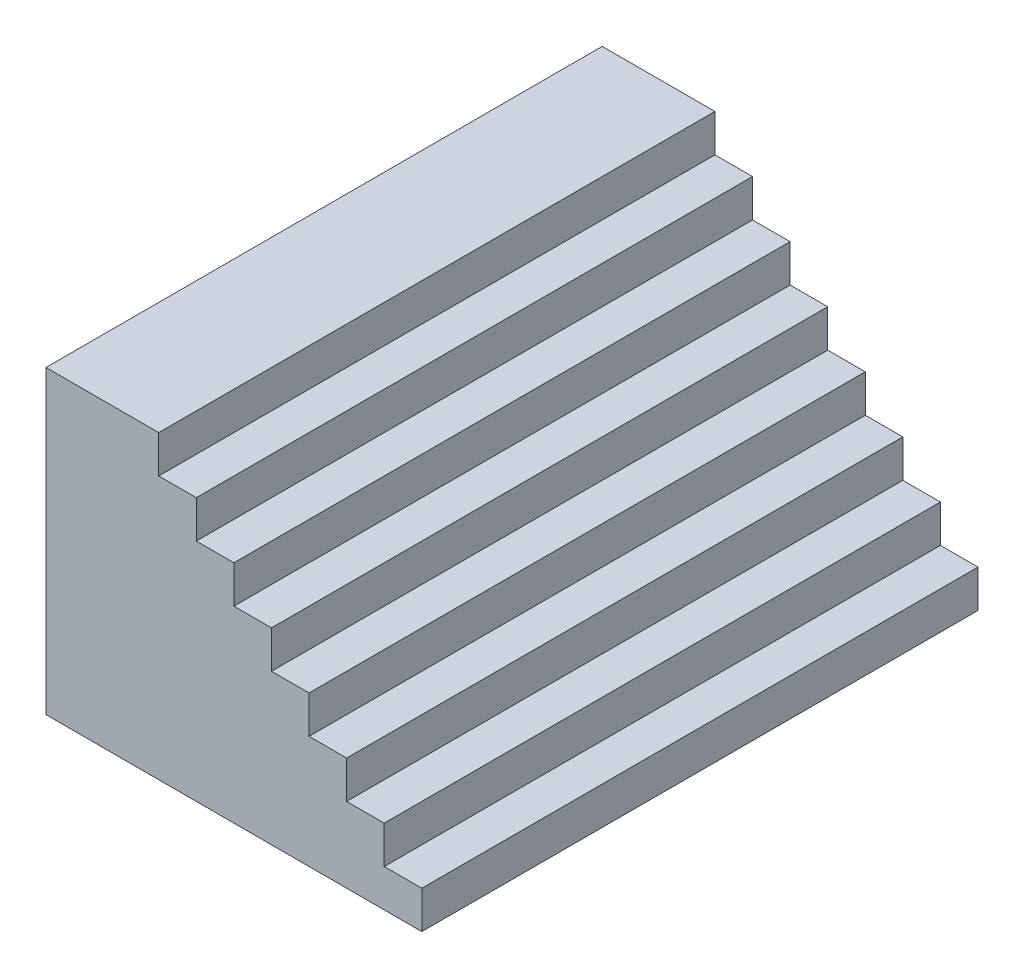
ISO-10303-21;
HEADER;
FILE_DESCRIPTION(('STEP AP214'),'2;1');
FILE_NAME('part.step','',(''),(''),'','','');
FILE_SCHEMA(('AUTOMOTIVE_DESIGN { 1 0 10303 214 1 1 1 1 }'));
ENDSEC;
DATA;
#1=APPLICATION_CONTEXT('core data for automotive mechanical design processes');
#2=APPLICATION_PROTOCOL_DEFINITION('international standard','automotive_design',2000,#1);
#3=PRODUCT_CONTEXT('',#1,'mechanical');
#4=PRODUCT('Part','Part','',(#3));
#5=PRODUCT_RELATED_PRODUCT_CATEGORY('part','',(#4));
#6=PRODUCT_DEFINITION_FORMATION('','',#4);
#7=PRODUCT_DEFINITION_CONTEXT('part definition',#1,'design');
#8=PRODUCT_DEFINITION('design','',#6,#7);
#9=PRODUCT_DEFINITION_SHAPE('','',#8);
#10=(LENGTH_UNIT() NAMED_UNIT(*) SI_UNIT(.MILLI.,.METRE.));
#11=(NAMED_UNIT(*) PLANE_ANGLE_UNIT() SI_UNIT($,.RADIAN.));
#12=(NAMED_UNIT(*) SI_UNIT($,.STERADIAN.) SOLID_ANGLE_UNIT());
#13=UNCERTAINTY_MEASURE_WITH_UNIT(LENGTH_MEASURE(1.E-05),#10,'distance_accuracy_value','');
#14=(GEOMETRIC_REPRESENTATION_CONTEXT(3) GLOBAL_UNCERTAINTY_ASSIGNED_CONTEXT((#13)) GLOBAL_UNIT_ASSIGNED_CONTEXT((#10,
#11,#12)) REPRESENTATION_CONTEXT('',''));
#15=CARTESIAN_POINT('',(0.,0.,0.));
#16=DIRECTION('',(0.,0.,1.));
#17=DIRECTION('',(1.,0.,0.));
#18=AXIS2_PLACEMENT_3D('',#15,#16,#17);
#19=CARTESIAN_POINT('',(2500.,1000.,1850.));
#20=DIRECTION('',(0.,0.,-1.));
#21=DIRECTION('',(0.,1.,0.));
#22=AXIS2_PLACEMENT_3D('',#19,#20,#21);
#23=PLANE('',#22);
#24=DIRECTION('',(0.,-1.,0.));
#25=VECTOR('',#24,1.);
#26=CARTESIAN_POINT('',(2500.,1000.,1850.));
#27=LINE('',#26,#25);
#28=CARTESIAN_POINT('',(2500.,-750.,1850.));
#29=VERTEX_POINT('',#28);
#30=CARTESIAN_POINT('',(2500.,-1000.,1850.));
#31=VERTEX_POINT('',#30);
#32=EDGE_CURVE('E119',#29,#31,#27,.T.);
#33=ORIENTED_EDGE('',*,*,#32,.F.);
#34=DIRECTION('',(1.,0.,0.));
#35=VECTOR('',#34,1.);
#36=CARTESIAN_POINT('',(2500.,-750.,1850.));
#37=LINE('',#36,#35);
#38=CARTESIAN_POINT('',(2250.,-750.,1850.));
#39=VERTEX_POINT('',#38);
#40=EDGE_CURVE('E60',#39,#29,#37,.T.);
#41=ORIENTED_EDGE('',*,*,#40,.F.);
#42=DIRECTION('',(0.,-1.,0.));
#43=VECTOR('',#42,1.);
#44=CARTESIAN_POINT('',(2250.,-750.,1850.));
#45=LINE('',#44,#43);
#46=CARTESIAN_POINT('',(2250.,-500.,1850.));
#47=VERTEX_POINT('',#46);
#48=EDGE_CURVE('E323',#47,#39,#45,.T.);
#49=ORIENTED_EDGE('',*,*,#48,.F.);
#50=DIRECTION('',(1.,0.,0.));
#51=VECTOR('',#50,1.);
#52=CARTESIAN_POINT('',(2250.,-500.,1850.));
#53=LINE('',#52,#51);
#54=CARTESIAN_POINT('',(2000.,-500.,1850.));
#55=VERTEX_POINT('',#54);
#56=EDGE_CURVE('E327',#55,#47,#53,.T.);
#57=ORIENTED_EDGE('',*,*,#56,.F.);
#58=DIRECTION('',(0.,-1.,0.));
#59=VECTOR('',#58,1.);
#60=CARTESIAN_POINT('',(2000.,-500.,1850.));
#61=LINE('',#60,#59);
#62=CARTESIAN_POINT('',(2000.,-250.,1850.));
#63=VERTEX_POINT('',#62);
#64=EDGE_CURVE('E203',#63,#55,#61,.T.);
#65=ORIENTED_EDGE('',*,*,#64,.F.);
#66=DIRECTION('',(1.,0.,0.));
#67=VECTOR('',#66,1.);
#68=CARTESIAN_POINT('',(2000.,-250.,1850.));
#69=LINE('',#68,#67);
#70=CARTESIAN_POINT('',(1750.,-250.,1850.));
#71=VERTEX_POINT('',#70);
#72=EDGE_CURVE('E548',#71,#63,#69,.T.);
#73=ORIENTED_EDGE('',*,*,#72,.F.);
#74=DIRECTION('',(0.,-1.,0.));
#75=VECTOR('',#74,1.);
#76=CARTESIAN_POINT('',(1750.,-250.,1850.));
#77=LINE('',#76,#75);
#78=CARTESIAN_POINT('',(1750.,0.,1850.));
#79=VERTEX_POINT('',#78);
#80=EDGE_CURVE('E229',#79,#71,#77,.T.);
#81=ORIENTED_EDGE('',*,*,#80,.F.);
#82=DIRECTION('',(1.,0.,0.));
#83=VECTOR('',#82,1.);
#84=CARTESIAN_POINT('',(1750.,0.,1850.));
#85=LINE('',#84,#83);
#86=CARTESIAN_POINT('',(1500.,0.,1850.));
#87=VERTEX_POINT('',#86);
#88=EDGE_CURVE('E540',#87,#79,#85,.T.);
#89=ORIENTED_EDGE('',*,*,#88,.F.);
#90=DIRECTION('',(0.,-1.,0.));
#91=VECTOR('',#90,1.);
#92=CARTESIAN_POINT('',(1500.,0.,1850.));
#93=LINE('',#92,#91);
#94=CARTESIAN_POINT('',(1500.,250.,1850.));
#95=VERTEX_POINT('',#94);
#96=EDGE_CURVE('E515',#95,#87,#93,.T.);
#97=ORIENTED_EDGE('',*,*,#96,.F.);
#98=DIRECTION('',(1.,0.,0.));
#99=VECTOR('',#98,1.);
#100=CARTESIAN_POINT('',(1500.,250.,1850.));
#101=LINE('',#100,#99);
#102=CARTESIAN_POINT('',(1250.,250.,1850.));
#103=VERTEX_POINT('',#102);
#104=EDGE_CURVE('E534',#103,#95,#101,.T.);
#105=ORIENTED_EDGE('',*,*,#104,.F.);
#106=DIRECTION('',(0.,-1.,0.));
#107=VECTOR('',#106,1.);
#108=CARTESIAN_POINT('',(1250.,250.,1850.));
#109=LINE('',#108,#107);
#110=CARTESIAN_POINT('',(1250.,500.,1850.));
#111=VERTEX_POINT('',#110);
#112=EDGE_CURVE('E526',#111,#103,#109,.T.);
#113=ORIENTED_EDGE('',*,*,#112,.F.);
#114=DIRECTION('',(1.,0.,0.));
#115=VECTOR('',#114,1.);
#116=CARTESIAN_POINT('',(1250.,500.,1850.));
#117=LINE('',#116,#115);
#118=CARTESIAN_POINT('',(1000.,500.,1850.));
#119=VERTEX_POINT('',#118);
#120=EDGE_CURVE('E535',#119,#111,#117,.T.);
#121=ORIENTED_EDGE('',*,*,#120,.F.);
#122=DIRECTION('',(0.,-1.,0.));
#123=VECTOR('',#122,1.);
#124=CARTESIAN_POINT('',(1000.,500.,1850.));
#125=LINE('',#124,#123);
#126=CARTESIAN_POINT('',(1000.,750.,1850.));
#127=VERTEX_POINT('',#126);
#128=EDGE_CURVE('E575',#127,#119,#125,.T.);
#129=ORIENTED_EDGE('',*,*,#128,.F.);
#130=DIRECTION('',(1.,0.,0.));
#131=VECTOR('',#130,1.);
#132=CARTESIAN_POINT('',(1000.,750.,1850.));
#133=LINE('',#132,#131);
#134=CARTESIAN_POINT('',(750.,750.,1850.));
#135=VERTEX_POINT('',#134);
#136=EDGE_CURVE('E570',#135,#127,#133,.T.);
#137=ORIENTED_EDGE('',*,*,#136,.F.);
#138=DIRECTION('',(0.,-1.,0.));
#139=VECTOR('',#138,1.);
#140=CARTESIAN_POINT('',(750.,750.,1850.));
#141=LINE('',#140,#139);
#142=CARTESIAN_POINT('',(750.,1000.,1850.));
#143=VERTEX_POINT('',#142);
#144=EDGE_CURVE('E97',#143,#135,#141,.T.);
#145=ORIENTED_EDGE('',*,*,#144,.F.);
#146=DIRECTION('',(-1.,0.,0.));
#147=VECTOR('',#146,1.);
#148=CARTESIAN_POINT('',(2500.,1000.,1850.));
#149=LINE('',#148,#147);
#150=CARTESIAN_POINT('',(0.,1000.,1850.));
#151=VERTEX_POINT('',#150);
#152=EDGE_CURVE('E89',#143,#151,#149,.T.);
#153=ORIENTED_EDGE('',*,*,#152,.T.);
#154=DIRECTION('',(0.,-1.,0.));
#155=VECTOR('',#154,1.);
#156=CARTESIAN_POINT('',(0.,1000.,1850.));
#157=LINE('',#156,#155);
#158=CARTESIAN_POINT('',(0.,-1000.,1850.));
#159=VERTEX_POINT('',#158);
#160=EDGE_CURVE('E93',#151,#159,#157,.T.);
#161=ORIENTED_EDGE('',*,*,#160,.T.);
#162=DIRECTION('',(-1.,0.,0.));
#163=VECTOR('',#162,1.);
#164=CARTESIAN_POINT('',(2500.,-1000.,1850.));
#165=LINE('',#164,#163);
#166=EDGE_CURVE('E134',#31,#159,#165,.T.);
#167=ORIENTED_EDGE('',*,*,#166,.F.);
#168=EDGE_LOOP('',(#33,#41,#49,#57,#65,#73,#81,#89,#97,#105,#113,#121,#129,#137,#145,#153,#161,#167));
#169=FACE_BOUND('',#168,.T.);
#170=ADVANCED_FACE('F45',(#169),#23,.F.);
#171=CARTESIAN_POINT('',(2500.,-1000.,1850.));
#172=DIRECTION('',(0.,1.,0.));
#173=DIRECTION('',(0.,0.,1.));
#174=AXIS2_PLACEMENT_3D('',#171,#172,#173);
#175=PLANE('',#174);
#176=DIRECTION('',(0.,0.,-1.));
#177=VECTOR('',#176,1.);
#178=CARTESIAN_POINT('',(0.,-1000.,1850.));
#179=LINE('',#178,#177);
#180=CARTESIAN_POINT('',(0.,-1000.,-1850.));
#181=VERTEX_POINT('',#180);
#182=EDGE_CURVE('E110',#159,#181,#179,.T.);
#183=ORIENTED_EDGE('',*,*,#182,.T.);
#184=DIRECTION('',(-1.,0.,0.));
#185=VECTOR('',#184,1.);
#186=CARTESIAN_POINT('',(2500.,-1000.,-1850.));
#187=LINE('',#186,#185);
#188=CARTESIAN_POINT('',(2500.,-1000.,-1850.));
#189=VERTEX_POINT('',#188);
#190=EDGE_CURVE('E131',#189,#181,#187,.T.);
#191=ORIENTED_EDGE('',*,*,#190,.F.);
#192=DIRECTION('',(0.,0.,-1.));
#193=VECTOR('',#192,1.);
#194=CARTESIAN_POINT('',(2500.,-1000.,1850.));
#195=LINE('',#194,#193);
#196=EDGE_CURVE('E124',#31,#189,#195,.T.);
#197=ORIENTED_EDGE('',*,*,#196,.F.);
#198=ORIENTED_EDGE('',*,*,#166,.T.);
#199=EDGE_LOOP('',(#183,#191,#197,#198));
#200=FACE_BOUND('',#199,.T.);
#201=ADVANCED_FACE('F285',(#200),#175,.F.);
#202=CARTESIAN_POINT('',(2500.,1000.,-1850.));
#203=DIRECTION('',(0.,0.,-1.));
#204=DIRECTION('',(0.,1.,0.));
#205=AXIS2_PLACEMENT_3D('',#202,#203,#204);
#206=PLANE('',#205);
#207=DIRECTION('',(-1.,0.,0.));
#208=VECTOR('',#207,1.);
#209=CARTESIAN_POINT('',(2500.,-750.,-1850.));
#210=LINE('',#209,#208);
#211=CARTESIAN_POINT('',(2500.,-750.,-1850.));
#212=VERTEX_POINT('',#211);
#213=CARTESIAN_POINT('',(2250.,-750.,-1850.));
#214=VERTEX_POINT('',#213);
#215=EDGE_CURVE('E271',#212,#214,#210,.T.);
#216=ORIENTED_EDGE('',*,*,#215,.F.);
#217=DIRECTION('',(0.,-1.,0.));
#218=VECTOR('',#217,1.);
#219=CARTESIAN_POINT('',(2500.,1000.,-1850.));
#220=LINE('',#219,#218);
#221=EDGE_CURVE('E69',#212,#189,#220,.T.);
#222=ORIENTED_EDGE('',*,*,#221,.T.);
#223=ORIENTED_EDGE('',*,*,#190,.T.);
#224=DIRECTION('',(0.,-1.,0.));
#225=VECTOR('',#224,1.);
#226=CARTESIAN_POINT('',(0.,1000.,-1850.));
#227=LINE('',#226,#225);
#228=CARTESIAN_POINT('',(0.,1000.,-1850.));
#229=VERTEX_POINT('',#228);
#230=EDGE_CURVE('E120',#229,#181,#227,.T.);
#231=ORIENTED_EDGE('',*,*,#230,.F.);
#232=DIRECTION('',(-1.,0.,0.));
#233=VECTOR('',#232,1.);
#234=CARTESIAN_POINT('',(2500.,1000.,-1850.));
#235=LINE('',#234,#233);
#236=CARTESIAN_POINT('',(750.,1000.,-1850.));
#237=VERTEX_POINT('',#236);
#238=EDGE_CURVE('E102',#237,#229,#235,.T.);
#239=ORIENTED_EDGE('',*,*,#238,.F.);
#240=DIRECTION('',(0.,1.,0.));
#241=VECTOR('',#240,1.);
#242=CARTESIAN_POINT('',(750.,1000.,-1850.));
#243=LINE('',#242,#241);
#244=CARTESIAN_POINT('',(750.,750.,-1850.));
#245=VERTEX_POINT('',#244);
#246=EDGE_CURVE('E113',#245,#237,#243,.T.);
#247=ORIENTED_EDGE('',*,*,#246,.F.);
#248=DIRECTION('',(-1.,0.,0.));
#249=VECTOR('',#248,1.);
#250=CARTESIAN_POINT('',(2500.,750.,-1850.));
#251=LINE('',#250,#249);
#252=CARTESIAN_POINT('',(1000.,750.,-1850.));
#253=VERTEX_POINT('',#252);
#254=EDGE_CURVE('E140',#253,#245,#251,.T.);
#255=ORIENTED_EDGE('',*,*,#254,.F.);
#256=DIRECTION('',(0.,1.,0.));
#257=VECTOR('',#256,1.);
#258=CARTESIAN_POINT('',(1000.,1000.,-1850.));
#259=LINE('',#258,#257);
#260=CARTESIAN_POINT('',(1000.,500.,-1850.));
#261=VERTEX_POINT('',#260);
#262=EDGE_CURVE('E144',#261,#253,#259,.T.);
#263=ORIENTED_EDGE('',*,*,#262,.F.);
#264=DIRECTION('',(-1.,0.,0.));
#265=VECTOR('',#264,1.);
#266=CARTESIAN_POINT('',(2500.,500.,-1850.));
#267=LINE('',#266,#265);
#268=CARTESIAN_POINT('',(1250.,500.,-1850.));
#269=VERTEX_POINT('',#268);
#270=EDGE_CURVE('E148',#269,#261,#267,.T.);
#271=ORIENTED_EDGE('',*,*,#270,.F.);
#272=DIRECTION('',(0.,1.,0.));
#273=VECTOR('',#272,1.);
#274=CARTESIAN_POINT('',(1250.,1000.,-1850.));
#275=LINE('',#274,#273);
#276=CARTESIAN_POINT('',(1250.,250.,-1850.));
#277=VERTEX_POINT('',#276);
#278=EDGE_CURVE('E152',#277,#269,#275,.T.);
#279=ORIENTED_EDGE('',*,*,#278,.F.);
#280=DIRECTION('',(-1.,0.,0.));
#281=VECTOR('',#280,1.);
#282=CARTESIAN_POINT('',(2500.,250.,-1850.));
#283=LINE('',#282,#281);
#284=CARTESIAN_POINT('',(1500.,250.,-1850.));
#285=VERTEX_POINT('',#284);
#286=EDGE_CURVE('E156',#285,#277,#283,.T.);
#287=ORIENTED_EDGE('',*,*,#286,.F.);
#288=DIRECTION('',(0.,1.,0.));
#289=VECTOR('',#288,1.);
#290=CARTESIAN_POINT('',(1500.,1000.,-1850.));
#291=LINE('',#290,#289);
#292=CARTESIAN_POINT('',(1500.,0.,-1850.));
#293=VERTEX_POINT('',#292);
#294=EDGE_CURVE('E160',#293,#285,#291,.T.);
#295=ORIENTED_EDGE('',*,*,#294,.F.);
#296=DIRECTION('',(-1.,0.,0.));
#297=VECTOR('',#296,1.);
#298=CARTESIAN_POINT('',(2500.,0.,-1850.));
#299=LINE('',#298,#297);
#300=CARTESIAN_POINT('',(1750.,0.,-1850.));
#301=VERTEX_POINT('',#300);
#302=EDGE_CURVE('E164',#301,#293,#299,.T.);
#303=ORIENTED_EDGE('',*,*,#302,.F.);
#304=DIRECTION('',(0.,1.,0.));
#305=VECTOR('',#304,1.);
#306=CARTESIAN_POINT('',(1750.,1000.,-1850.));
#307=LINE('',#306,#305);
#308=CARTESIAN_POINT('',(1750.,-250.,-1850.));
#309=VERTEX_POINT('',#308);
#310=EDGE_CURVE('E168',#309,#301,#307,.T.);
#311=ORIENTED_EDGE('',*,*,#310,.F.);
#312=DIRECTION('',(-1.,0.,0.));
#313=VECTOR('',#312,1.);
#314=CARTESIAN_POINT('',(2500.,-250.,-1850.));
#315=LINE('',#314,#313);
#316=CARTESIAN_POINT('',(2000.,-250.,-1850.));
#317=VERTEX_POINT('',#316);
#318=EDGE_CURVE('E172',#317,#309,#315,.T.);
#319=ORIENTED_EDGE('',*,*,#318,.F.);
#320=DIRECTION('',(0.,1.,0.));
#321=VECTOR('',#320,1.);
#322=CARTESIAN_POINT('',(2000.,1000.,-1850.));
#323=LINE('',#322,#321);
#324=CARTESIAN_POINT('',(2000.,-500.,-1850.));
#325=VERTEX_POINT('',#324);
#326=EDGE_CURVE('E176',#325,#317,#323,.T.);
#327=ORIENTED_EDGE('',*,*,#326,.F.);
#328=DIRECTION('',(-1.,0.,0.));
#329=VECTOR('',#328,1.);
#330=CARTESIAN_POINT('',(2500.,-500.,-1850.));
#331=LINE('',#330,#329);
#332=CARTESIAN_POINT('',(2250.,-500.,-1850.));
#333=VERTEX_POINT('',#332);
#334=EDGE_CURVE('E53',#333,#325,#331,.T.);
#335=ORIENTED_EDGE('',*,*,#334,.F.);
#336=DIRECTION('',(0.,1.,0.));
#337=VECTOR('',#336,1.);
#338=CARTESIAN_POINT('',(2250.,1000.,-1850.));
#339=LINE('',#338,#337);
#340=EDGE_CURVE('E11',#214,#333,#339,.T.);
#341=ORIENTED_EDGE('',*,*,#340,.F.);
#342=EDGE_LOOP('',(#216,#222,#223,#231,#239,#247,#255,#263,#271,#279,#287,#295,#303,#311,#319,
#327,#335,#341));
#343=FACE_BOUND('',#342,.T.);
#344=ADVANCED_FACE('F209',(#343),#206,.T.);
#345=CARTESIAN_POINT('',(2500.,1000.,1850.));
#346=DIRECTION('',(0.,1.,0.));
#347=DIRECTION('',(0.,0.,1.));
#348=AXIS2_PLACEMENT_3D('',#345,#346,#347);
#349=PLANE('',#348);
#350=DIRECTION('',(0.,0.,1.));
#351=VECTOR('',#350,1.);
#352=CARTESIAN_POINT('',(750.,1000.,-3150.));
#353=LINE('',#352,#351);
#354=EDGE_CURVE('E267',#237,#143,#353,.T.);
#355=ORIENTED_EDGE('',*,*,#354,.F.);
#356=ORIENTED_EDGE('',*,*,#238,.T.);
#357=DIRECTION('',(0.,0.,-1.));
#358=VECTOR('',#357,1.);
#359=CARTESIAN_POINT('',(0.,1000.,1850.));
#360=LINE('',#359,#358);
#361=EDGE_CURVE('E108',#151,#229,#360,.T.);
#362=ORIENTED_EDGE('',*,*,#361,.F.);
#363=ORIENTED_EDGE('',*,*,#152,.F.);
#364=EDGE_LOOP('',(#355,#356,#362,#363));
#365=FACE_BOUND('',#364,.T.);
#366=ADVANCED_FACE('F115',(#365),#349,.T.);
#367=CARTESIAN_POINT('',(2500.,0.,0.));
#368=DIRECTION('',(1.,0.,0.));
#369=DIRECTION('',(0.,0.,-1.));
#370=AXIS2_PLACEMENT_3D('',#367,#368,#369);
#371=PLANE('',#370);
#372=DIRECTION('',(0.,0.,-1.));
#373=VECTOR('',#372,1.);
#374=CARTESIAN_POINT('',(2500.,-750.,0.));
#375=LINE('',#374,#373);
#376=EDGE_CURVE('E137',#29,#212,#375,.T.);
#377=ORIENTED_EDGE('',*,*,#376,.F.);
#378=ORIENTED_EDGE('',*,*,#32,.T.);
#379=ORIENTED_EDGE('',*,*,#196,.T.);
#380=ORIENTED_EDGE('',*,*,#221,.F.);
#381=EDGE_LOOP('',(#377,#378,#379,#380));
#382=FACE_BOUND('',#381,.T.);
#383=ADVANCED_FACE('F321',(#382),#371,.T.);
#384=CARTESIAN_POINT('',(0.,0.,0.));
#385=DIRECTION('',(1.,0.,0.));
#386=DIRECTION('',(0.,0.,-1.));
#387=AXIS2_PLACEMENT_3D('',#384,#385,#386);
#388=PLANE('',#387);
#389=ORIENTED_EDGE('',*,*,#160,.F.);
#390=ORIENTED_EDGE('',*,*,#361,.T.);
#391=ORIENTED_EDGE('',*,*,#230,.T.);
#392=ORIENTED_EDGE('',*,*,#182,.F.);
#393=EDGE_LOOP('',(#389,#390,#391,#392));
#394=FACE_BOUND('',#393,.T.);
#395=ADVANCED_FACE('F106',(#394),#388,.F.);
#396=CARTESIAN_POINT('',(2500.,-750.,-3150.));
#397=DIRECTION('',(0.,-1.,0.));
#398=DIRECTION('',(1.,0.,0.));
#399=AXIS2_PLACEMENT_3D('',#396,#397,#398);
#400=PLANE('',#399);
#401=ORIENTED_EDGE('',*,*,#215,.T.);
#402=DIRECTION('',(0.,0.,1.));
#403=VECTOR('',#402,1.);
#404=CARTESIAN_POINT('',(2250.,-750.,-3150.));
#405=LINE('',#404,#403);
#406=EDGE_CURVE('E275',#214,#39,#405,.T.);
#407=ORIENTED_EDGE('',*,*,#406,.T.);
#408=ORIENTED_EDGE('',*,*,#40,.T.);
#409=ORIENTED_EDGE('',*,*,#376,.T.);
#410=EDGE_LOOP('',(#401,#407,#408,#409));
#411=FACE_BOUND('',#410,.T.);
#412=ADVANCED_FACE('F334',(#411),#400,.F.);
#413=CARTESIAN_POINT('',(2250.,-750.,-3150.));
#414=DIRECTION('',(-1.,0.,0.));
#415=DIRECTION('',(0.,0.,1.));
#416=AXIS2_PLACEMENT_3D('',#413,#414,#415);
#417=PLANE('',#416);
#418=ORIENTED_EDGE('',*,*,#340,.T.);
#419=DIRECTION('',(0.,0.,1.));
#420=VECTOR('',#419,1.);
#421=CARTESIAN_POINT('',(2250.,-500.,-3150.));
#422=LINE('',#421,#420);
#423=EDGE_CURVE('E193',#333,#47,#422,.T.);
#424=ORIENTED_EDGE('',*,*,#423,.T.);
#425=ORIENTED_EDGE('',*,*,#48,.T.);
#426=ORIENTED_EDGE('',*,*,#406,.F.);
#427=EDGE_LOOP('',(#418,#424,#425,#426));
#428=FACE_BOUND('',#427,.T.);
#429=ADVANCED_FACE('F318',(#428),#417,.F.);
#430=CARTESIAN_POINT('',(2250.,-500.,-3150.));
#431=DIRECTION('',(0.,-1.,0.));
#432=DIRECTION('',(1.,0.,0.));
#433=AXIS2_PLACEMENT_3D('',#430,#431,#432);
#434=PLANE('',#433);
#435=ORIENTED_EDGE('',*,*,#334,.T.);
#436=DIRECTION('',(0.,0.,1.));
#437=VECTOR('',#436,1.);
#438=CARTESIAN_POINT('',(2000.,-500.,-3150.));
#439=LINE('',#438,#437);
#440=EDGE_CURVE('E190',#325,#55,#439,.T.);
#441=ORIENTED_EDGE('',*,*,#440,.T.);
#442=ORIENTED_EDGE('',*,*,#56,.T.);
#443=ORIENTED_EDGE('',*,*,#423,.F.);
#444=EDGE_LOOP('',(#435,#441,#442,#443));
#445=FACE_BOUND('',#444,.T.);
#446=ADVANCED_FACE('F187',(#445),#434,.F.);
#447=CARTESIAN_POINT('',(2000.,-500.,-3150.));
#448=DIRECTION('',(-1.,0.,0.));
#449=DIRECTION('',(0.,0.,1.));
#450=AXIS2_PLACEMENT_3D('',#447,#448,#449);
#451=PLANE('',#450);
#452=ORIENTED_EDGE('',*,*,#326,.T.);
#453=DIRECTION('',(0.,0.,1.));
#454=VECTOR('',#453,1.);
#455=CARTESIAN_POINT('',(2000.,-250.,-3150.));
#456=LINE('',#455,#454);
#457=EDGE_CURVE('E206',#317,#63,#456,.T.);
#458=ORIENTED_EDGE('',*,*,#457,.T.);
#459=ORIENTED_EDGE('',*,*,#64,.T.);
#460=ORIENTED_EDGE('',*,*,#440,.F.);
#461=EDGE_LOOP('',(#452,#458,#459,#460));
#462=FACE_BOUND('',#461,.T.);
#463=ADVANCED_FACE('F199',(#462),#451,.F.);
#464=CARTESIAN_POINT('',(2000.,-250.,-3150.));
#465=DIRECTION('',(0.,-1.,0.));
#466=DIRECTION('',(0.,0.,-1.));
#467=AXIS2_PLACEMENT_3D('',#464,#465,#466);
#468=PLANE('',#467);
#469=ORIENTED_EDGE('',*,*,#318,.T.);
#470=DIRECTION('',(0.,0.,1.));
#471=VECTOR('',#470,1.);
#472=CARTESIAN_POINT('',(1750.,-250.,-3150.));
#473=LINE('',#472,#471);
#474=EDGE_CURVE('E220',#309,#71,#473,.T.);
#475=ORIENTED_EDGE('',*,*,#474,.T.);
#476=ORIENTED_EDGE('',*,*,#72,.T.);
#477=ORIENTED_EDGE('',*,*,#457,.F.);
#478=EDGE_LOOP('',(#469,#475,#476,#477));
#479=FACE_BOUND('',#478,.T.);
#480=ADVANCED_FACE('F217',(#479),#468,.F.);
#481=CARTESIAN_POINT('',(1750.,-250.,-3150.));
#482=DIRECTION('',(-1.,0.,0.));
#483=DIRECTION('',(0.,0.,1.));
#484=AXIS2_PLACEMENT_3D('',#481,#482,#483);
#485=PLANE('',#484);
#486=ORIENTED_EDGE('',*,*,#310,.T.);
#487=DIRECTION('',(0.,0.,1.));
#488=VECTOR('',#487,1.);
#489=CARTESIAN_POINT('',(1750.,0.,-3150.));
#490=LINE('',#489,#488);
#491=EDGE_CURVE('E232',#301,#79,#490,.T.);
#492=ORIENTED_EDGE('',*,*,#491,.T.);
#493=ORIENTED_EDGE('',*,*,#80,.T.);
#494=ORIENTED_EDGE('',*,*,#474,.F.);
#495=EDGE_LOOP('',(#486,#492,#493,#494));
#496=FACE_BOUND('',#495,.T.);
#497=ADVANCED_FACE('F225',(#496),#485,.F.);
#498=CARTESIAN_POINT('',(1750.,0.,-3150.));
#499=DIRECTION('',(0.,-1.,0.));
#500=DIRECTION('',(1.,0.,0.));
#501=AXIS2_PLACEMENT_3D('',#498,#499,#500);
#502=PLANE('',#501);
#503=ORIENTED_EDGE('',*,*,#302,.T.);
#504=DIRECTION('',(0.,0.,1.));
#505=VECTOR('',#504,1.);
#506=CARTESIAN_POINT('',(1500.,0.,-3150.));
#507=LINE('',#506,#505);
#508=EDGE_CURVE('E237',#293,#87,#507,.T.);
#509=ORIENTED_EDGE('',*,*,#508,.T.);
#510=ORIENTED_EDGE('',*,*,#88,.T.);
#511=ORIENTED_EDGE('',*,*,#491,.F.);
#512=EDGE_LOOP('',(#503,#509,#510,#511));
#513=FACE_BOUND('',#512,.T.);
#514=ADVANCED_FACE('F382',(#513),#502,.F.);
#515=CARTESIAN_POINT('',(1500.,0.,-3150.));
#516=DIRECTION('',(-1.,0.,0.));
#517=DIRECTION('',(0.,0.,1.));
#518=AXIS2_PLACEMENT_3D('',#515,#516,#517);
#519=PLANE('',#518);
#520=ORIENTED_EDGE('',*,*,#294,.T.);
#521=DIRECTION('',(0.,0.,1.));
#522=VECTOR('',#521,1.);
#523=CARTESIAN_POINT('',(1500.,250.,-3150.));
#524=LINE('',#523,#522);
#525=EDGE_CURVE('E243',#285,#95,#524,.T.);
#526=ORIENTED_EDGE('',*,*,#525,.T.);
#527=ORIENTED_EDGE('',*,*,#96,.T.);
#528=ORIENTED_EDGE('',*,*,#508,.F.);
#529=EDGE_LOOP('',(#520,#526,#527,#528));
#530=FACE_BOUND('',#529,.T.);
#531=ADVANCED_FACE('F378',(#530),#519,.F.);
#532=CARTESIAN_POINT('',(1500.,250.,-3150.));
#533=DIRECTION('',(0.,-1.,0.));
#534=DIRECTION('',(0.,0.,-1.));
#535=AXIS2_PLACEMENT_3D('',#532,#533,#534);
#536=PLANE('',#535);
#537=ORIENTED_EDGE('',*,*,#286,.T.);
#538=DIRECTION('',(0.,0.,1.));
#539=VECTOR('',#538,1.);
#540=CARTESIAN_POINT('',(1250.,250.,-3150.));
#541=LINE('',#540,#539);
#542=EDGE_CURVE('E247',#277,#103,#541,.T.);
#543=ORIENTED_EDGE('',*,*,#542,.T.);
#544=ORIENTED_EDGE('',*,*,#104,.T.);
#545=ORIENTED_EDGE('',*,*,#525,.F.);
#546=EDGE_LOOP('',(#537,#543,#544,#545));
#547=FACE_BOUND('',#546,.T.);
#548=ADVANCED_FACE('F374',(#547),#536,.F.);
#549=CARTESIAN_POINT('',(1250.,250.,-3150.));
#550=DIRECTION('',(-1.,0.,0.));
#551=DIRECTION('',(0.,0.,1.));
#552=AXIS2_PLACEMENT_3D('',#549,#550,#551);
#553=PLANE('',#552);
#554=ORIENTED_EDGE('',*,*,#278,.T.);
#555=DIRECTION('',(0.,0.,1.));
#556=VECTOR('',#555,1.);
#557=CARTESIAN_POINT('',(1250.,500.,-3150.));
#558=LINE('',#557,#556);
#559=EDGE_CURVE('E251',#269,#111,#558,.T.);
#560=ORIENTED_EDGE('',*,*,#559,.T.);
#561=ORIENTED_EDGE('',*,*,#112,.T.);
#562=ORIENTED_EDGE('',*,*,#542,.F.);
#563=EDGE_LOOP('',(#554,#560,#561,#562));
#564=FACE_BOUND('',#563,.T.);
#565=ADVANCED_FACE('F370',(#564),#553,.F.);
#566=CARTESIAN_POINT('',(1250.,500.,-3150.));
#567=DIRECTION('',(0.,-1.,0.));
#568=DIRECTION('',(0.,0.,-1.));
#569=AXIS2_PLACEMENT_3D('',#566,#567,#568);
#570=PLANE('',#569);
#571=ORIENTED_EDGE('',*,*,#270,.T.);
#572=DIRECTION('',(0.,0.,1.));
#573=VECTOR('',#572,1.);
#574=CARTESIAN_POINT('',(1000.,500.,-3150.));
#575=LINE('',#574,#573);
#576=EDGE_CURVE('E255',#261,#119,#575,.T.);
#577=ORIENTED_EDGE('',*,*,#576,.T.);
#578=ORIENTED_EDGE('',*,*,#120,.T.);
#579=ORIENTED_EDGE('',*,*,#559,.F.);
#580=EDGE_LOOP('',(#571,#577,#578,#579));
#581=FACE_BOUND('',#580,.T.);
#582=ADVANCED_FACE('F366',(#581),#570,.F.);
#583=CARTESIAN_POINT('',(1000.,500.,-3150.));
#584=DIRECTION('',(-1.,0.,0.));
#585=DIRECTION('',(0.,0.,1.));
#586=AXIS2_PLACEMENT_3D('',#583,#584,#585);
#587=PLANE('',#586);
#588=ORIENTED_EDGE('',*,*,#262,.T.);
#589=DIRECTION('',(0.,0.,1.));
#590=VECTOR('',#589,1.);
#591=CARTESIAN_POINT('',(1000.,750.,-3150.));
#592=LINE('',#591,#590);
#593=EDGE_CURVE('E259',#253,#127,#592,.T.);
#594=ORIENTED_EDGE('',*,*,#593,.T.);
#595=ORIENTED_EDGE('',*,*,#128,.T.);
#596=ORIENTED_EDGE('',*,*,#576,.F.);
#597=EDGE_LOOP('',(#588,#594,#595,#596));
#598=FACE_BOUND('',#597,.T.);
#599=ADVANCED_FACE('F362',(#598),#587,.F.);
#600=CARTESIAN_POINT('',(1000.,750.,-3150.));
#601=DIRECTION('',(0.,-1.,0.));
#602=DIRECTION('',(0.,0.,-1.));
#603=AXIS2_PLACEMENT_3D('',#600,#601,#602);
#604=PLANE('',#603);
#605=ORIENTED_EDGE('',*,*,#254,.T.);
#606=DIRECTION('',(0.,0.,1.));
#607=VECTOR('',#606,1.);
#608=CARTESIAN_POINT('',(750.,750.,-3150.));
#609=LINE('',#608,#607);
#610=EDGE_CURVE('E263',#245,#135,#609,.T.);
#611=ORIENTED_EDGE('',*,*,#610,.T.);
#612=ORIENTED_EDGE('',*,*,#136,.T.);
#613=ORIENTED_EDGE('',*,*,#593,.F.);
#614=EDGE_LOOP('',(#605,#611,#612,#613));
#615=FACE_BOUND('',#614,.T.);
#616=ADVANCED_FACE('F359',(#615),#604,.F.);
#617=CARTESIAN_POINT('',(750.,750.,-3150.));
#618=DIRECTION('',(-1.,0.,0.));
#619=DIRECTION('',(0.,0.,1.));
#620=AXIS2_PLACEMENT_3D('',#617,#618,#619);
#621=PLANE('',#620);
#622=ORIENTED_EDGE('',*,*,#246,.T.);
#623=ORIENTED_EDGE('',*,*,#354,.T.);
#624=ORIENTED_EDGE('',*,*,#144,.T.);
#625=ORIENTED_EDGE('',*,*,#610,.F.);
#626=EDGE_LOOP('',(#622,#623,#624,#625));
#627=FACE_BOUND('',#626,.T.);
#628=ADVANCED_FACE('F356',(#627),#621,.F.);
#629=CLOSED_SHELL('',(#170,#201,#344,#366,#383,#395,#412,#429,#446,#463,#480,#497,#514,#531,
#548,#565,#582,#599,#616,#628));
#630=MANIFOLD_SOLID_BREP('B2',#629);
#631=ADVANCED_BREP_SHAPE_REPRESENTATION('',(#18,#630),#14);
#632=SHAPE_DEFINITION_REPRESENTATION(#9,#631);
ENDSEC;
END-ISO-10303-21;
